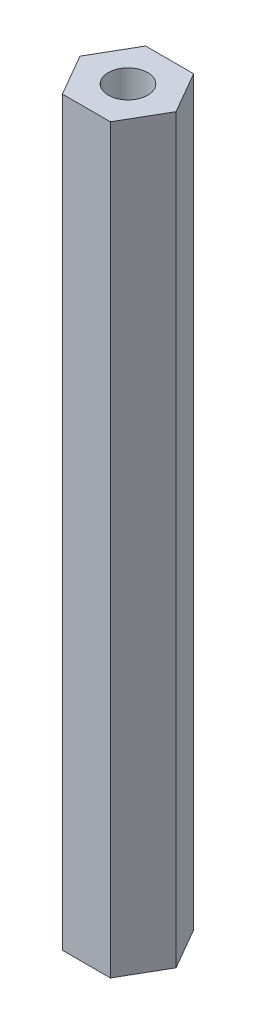
ISO-10303-21;
HEADER;
FILE_DESCRIPTION(('STEP AP214'),'2;1');
FILE_NAME('part.step','',(''),(''),'','','');
FILE_SCHEMA(('AUTOMOTIVE_DESIGN { 1 0 10303 214 1 1 1 1 }'));
ENDSEC;
DATA;
#1=APPLICATION_CONTEXT('core data for automotive mechanical design processes');
#2=APPLICATION_PROTOCOL_DEFINITION('international standard','automotive_design',2000,#1);
#3=PRODUCT_CONTEXT('',#1,'mechanical');
#4=PRODUCT('Part','Part','',(#3));
#5=PRODUCT_RELATED_PRODUCT_CATEGORY('part','',(#4));
#6=PRODUCT_DEFINITION_FORMATION('','',#4);
#7=PRODUCT_DEFINITION_CONTEXT('part definition',#1,'design');
#8=PRODUCT_DEFINITION('design','',#6,#7);
#9=PRODUCT_DEFINITION_SHAPE('','',#8);
#10=(LENGTH_UNIT() NAMED_UNIT(*) SI_UNIT(.MILLI.,.METRE.));
#11=(NAMED_UNIT(*) PLANE_ANGLE_UNIT() SI_UNIT($,.RADIAN.));
#12=(NAMED_UNIT(*) SI_UNIT($,.STERADIAN.) SOLID_ANGLE_UNIT());
#13=UNCERTAINTY_MEASURE_WITH_UNIT(LENGTH_MEASURE(1.E-05),#10,'distance_accuracy_value','');
#14=(GEOMETRIC_REPRESENTATION_CONTEXT(3) GLOBAL_UNCERTAINTY_ASSIGNED_CONTEXT((#13)) GLOBAL_UNIT_ASSIGNED_CONTEXT((#10,
#11,#12)) REPRESENTATION_CONTEXT('',''));
#15=CARTESIAN_POINT('',(0.,0.,0.));
#16=DIRECTION('',(0.,0.,1.));
#17=DIRECTION('',(1.,0.,0.));
#18=AXIS2_PLACEMENT_3D('',#15,#16,#17);
#19=CARTESIAN_POINT('',(1.5877132402715,-24.5,2.74999999999998));
#20=DIRECTION('',(0.866025403784442,0.,0.499999999999995));
#21=DIRECTION('',(0.499999999999995,0.,-0.866025403784442));
#22=AXIS2_PLACEMENT_3D('',#19,#20,#21);
#23=PLANE('',#22);
#24=DIRECTION('',(0.,1.,0.));
#25=VECTOR('',#24,1.);
#26=CARTESIAN_POINT('',(3.17542648054294,-24.5,0.));
#27=LINE('',#26,#25);
#28=CARTESIAN_POINT('',(3.17542648054294,-24.5,0.));
#29=VERTEX_POINT('',#28);
#30=CARTESIAN_POINT('',(3.17542648054294,24.5,0.));
#31=VERTEX_POINT('',#30);
#32=EDGE_CURVE('E42',#29,#31,#27,.T.);
#33=ORIENTED_EDGE('',*,*,#32,.T.);
#34=DIRECTION('',(0.499999999999995,0.,-0.866025403784442));
#35=VECTOR('',#34,1.);
#36=CARTESIAN_POINT('',(1.5877132402715,24.5,2.74999999999998));
#37=LINE('',#36,#35);
#38=CARTESIAN_POINT('',(1.5877132402715,24.5,2.74999999999998));
#39=VERTEX_POINT('',#38);
#40=EDGE_CURVE('E122',#39,#31,#37,.T.);
#41=ORIENTED_EDGE('',*,*,#40,.F.);
#42=DIRECTION('',(0.,1.,0.));
#43=VECTOR('',#42,1.);
#44=CARTESIAN_POINT('',(1.5877132402715,-24.5,2.74999999999998));
#45=LINE('',#44,#43);
#46=CARTESIAN_POINT('',(1.5877132402715,-24.5,2.74999999999998));
#47=VERTEX_POINT('',#46);
#48=EDGE_CURVE('E11',#47,#39,#45,.T.);
#49=ORIENTED_EDGE('',*,*,#48,.F.);
#50=DIRECTION('',(0.499999999999995,0.,-0.866025403784442));
#51=VECTOR('',#50,1.);
#52=CARTESIAN_POINT('',(1.5877132402715,-24.5,2.74999999999998));
#53=LINE('',#52,#51);
#54=EDGE_CURVE('E146',#47,#29,#53,.T.);
#55=ORIENTED_EDGE('',*,*,#54,.T.);
#56=EDGE_LOOP('',(#33,#41,#49,#55));
#57=FACE_BOUND('',#56,.T.);
#58=ADVANCED_FACE('F39',(#57),#23,.T.);
#59=CARTESIAN_POINT('',(-1.58771324027145,-24.5,2.75000000000002));
#60=DIRECTION('',(0.,0.,1.));
#61=DIRECTION('',(1.,0.,0.));
#62=AXIS2_PLACEMENT_3D('',#59,#60,#61);
#63=PLANE('',#62);
#64=ORIENTED_EDGE('',*,*,#48,.T.);
#65=DIRECTION('',(1.,0.,0.));
#66=VECTOR('',#65,1.);
#67=CARTESIAN_POINT('',(-1.58771324027145,24.5,2.75000000000002));
#68=LINE('',#67,#66);
#69=CARTESIAN_POINT('',(-1.58771324027145,24.5,2.75000000000002));
#70=VERTEX_POINT('',#69);
#71=EDGE_CURVE('E142',#70,#39,#68,.T.);
#72=ORIENTED_EDGE('',*,*,#71,.F.);
#73=DIRECTION('',(0.,1.,0.));
#74=VECTOR('',#73,1.);
#75=CARTESIAN_POINT('',(-1.58771324027145,-24.5,2.75000000000002));
#76=LINE('',#75,#74);
#77=CARTESIAN_POINT('',(-1.58771324027145,-24.5,2.75000000000002));
#78=VERTEX_POINT('',#77);
#79=EDGE_CURVE('E48',#78,#70,#76,.T.);
#80=ORIENTED_EDGE('',*,*,#79,.F.);
#81=DIRECTION('',(1.,0.,0.));
#82=VECTOR('',#81,1.);
#83=CARTESIAN_POINT('',(-1.58771324027145,-24.5,2.75000000000002));
#84=LINE('',#83,#82);
#85=EDGE_CURVE('E164',#78,#47,#84,.T.);
#86=ORIENTED_EDGE('',*,*,#85,.T.);
#87=EDGE_LOOP('',(#64,#72,#80,#86));
#88=FACE_BOUND('',#87,.T.);
#89=ADVANCED_FACE('F185',(#88),#63,.T.);
#90=CARTESIAN_POINT('',(-3.17542648054294,-24.5,0.));
#91=DIRECTION('',(-0.866025403784435,0.,0.500000000000007));
#92=DIRECTION('',(0.500000000000007,0.,0.866025403784435));
#93=AXIS2_PLACEMENT_3D('',#90,#91,#92);
#94=PLANE('',#93);
#95=ORIENTED_EDGE('',*,*,#79,.T.);
#96=DIRECTION('',(0.500000000000007,0.,0.866025403784435));
#97=VECTOR('',#96,1.);
#98=CARTESIAN_POINT('',(-3.17542648054294,24.5,0.));
#99=LINE('',#98,#97);
#100=CARTESIAN_POINT('',(-3.17542648054294,24.5,0.));
#101=VERTEX_POINT('',#100);
#102=EDGE_CURVE('E138',#101,#70,#99,.T.);
#103=ORIENTED_EDGE('',*,*,#102,.F.);
#104=DIRECTION('',(0.,1.,0.));
#105=VECTOR('',#104,1.);
#106=CARTESIAN_POINT('',(-3.17542648054294,-24.5,0.));
#107=LINE('',#106,#105);
#108=CARTESIAN_POINT('',(-3.17542648054294,-24.5,0.));
#109=VERTEX_POINT('',#108);
#110=EDGE_CURVE('E169',#109,#101,#107,.T.);
#111=ORIENTED_EDGE('',*,*,#110,.F.);
#112=DIRECTION('',(0.500000000000007,0.,0.866025403784435));
#113=VECTOR('',#112,1.);
#114=CARTESIAN_POINT('',(-3.17542648054294,-24.5,0.));
#115=LINE('',#114,#113);
#116=EDGE_CURVE('E161',#109,#78,#115,.T.);
#117=ORIENTED_EDGE('',*,*,#116,.T.);
#118=EDGE_LOOP('',(#95,#103,#111,#117));
#119=FACE_BOUND('',#118,.T.);
#120=ADVANCED_FACE('F198',(#119),#94,.T.);
#121=CARTESIAN_POINT('',(-1.58771324027148,-24.5,-2.74999999999999));
#122=DIRECTION('',(-0.866025403784442,0.,-0.499999999999995));
#123=DIRECTION('',(-0.499999999999995,0.,0.866025403784442));
#124=AXIS2_PLACEMENT_3D('',#121,#122,#123);
#125=PLANE('',#124);
#126=ORIENTED_EDGE('',*,*,#110,.T.);
#127=DIRECTION('',(-0.499999999999995,0.,0.866025403784441));
#128=VECTOR('',#127,1.);
#129=CARTESIAN_POINT('',(-1.58771324027148,24.5,-2.74999999999999));
#130=LINE('',#129,#128);
#131=CARTESIAN_POINT('',(-1.58771324027148,24.5,-2.74999999999999));
#132=VERTEX_POINT('',#131);
#133=EDGE_CURVE('E134',#132,#101,#130,.T.);
#134=ORIENTED_EDGE('',*,*,#133,.F.);
#135=DIRECTION('',(0.,1.,0.));
#136=VECTOR('',#135,1.);
#137=CARTESIAN_POINT('',(-1.58771324027148,-24.5,-2.74999999999999));
#138=LINE('',#137,#136);
#139=CARTESIAN_POINT('',(-1.58771324027148,-24.5,-2.74999999999999));
#140=VERTEX_POINT('',#139);
#141=EDGE_CURVE('E172',#140,#132,#138,.T.);
#142=ORIENTED_EDGE('',*,*,#141,.F.);
#143=DIRECTION('',(-0.499999999999995,0.,0.866025403784441));
#144=VECTOR('',#143,1.);
#145=CARTESIAN_POINT('',(-1.58771324027148,-24.5,-2.74999999999999));
#146=LINE('',#145,#144);
#147=EDGE_CURVE('E157',#140,#109,#146,.T.);
#148=ORIENTED_EDGE('',*,*,#147,.T.);
#149=EDGE_LOOP('',(#126,#134,#142,#148));
#150=FACE_BOUND('',#149,.T.);
#151=ADVANCED_FACE('F196',(#150),#125,.T.);
#152=CARTESIAN_POINT('',(1.58771324027147,-24.5,-2.75000000000001));
#153=DIRECTION('',(0.,0.,-1.));
#154=DIRECTION('',(-1.,0.,0.));
#155=AXIS2_PLACEMENT_3D('',#152,#153,#154);
#156=PLANE('',#155);
#157=ORIENTED_EDGE('',*,*,#141,.T.);
#158=DIRECTION('',(-1.,0.,0.));
#159=VECTOR('',#158,1.);
#160=CARTESIAN_POINT('',(1.58771324027147,24.5,-2.75000000000001));
#161=LINE('',#160,#159);
#162=CARTESIAN_POINT('',(1.58771324027147,24.5,-2.75000000000001));
#163=VERTEX_POINT('',#162);
#164=EDGE_CURVE('E130',#163,#132,#161,.T.);
#165=ORIENTED_EDGE('',*,*,#164,.F.);
#166=DIRECTION('',(0.,1.,0.));
#167=VECTOR('',#166,1.);
#168=CARTESIAN_POINT('',(1.58771324027147,-24.5,-2.75000000000001));
#169=LINE('',#168,#167);
#170=CARTESIAN_POINT('',(1.58771324027147,-24.5,-2.75000000000001));
#171=VERTEX_POINT('',#170);
#172=EDGE_CURVE('E174',#171,#163,#169,.T.);
#173=ORIENTED_EDGE('',*,*,#172,.F.);
#174=DIRECTION('',(-1.,0.,0.));
#175=VECTOR('',#174,1.);
#176=CARTESIAN_POINT('',(1.58771324027147,-24.5,-2.75000000000001));
#177=LINE('',#176,#175);
#178=EDGE_CURVE('E153',#171,#140,#177,.T.);
#179=ORIENTED_EDGE('',*,*,#178,.T.);
#180=EDGE_LOOP('',(#157,#165,#173,#179));
#181=FACE_BOUND('',#180,.T.);
#182=ADVANCED_FACE('F193',(#181),#156,.T.);
#183=CARTESIAN_POINT('',(3.17542648054294,-24.5,0.));
#184=DIRECTION('',(0.866025403784438,0.,-0.500000000000001));
#185=DIRECTION('',(-0.500000000000001,0.,-0.866025403784438));
#186=AXIS2_PLACEMENT_3D('',#183,#184,#185);
#187=PLANE('',#186);
#188=ORIENTED_EDGE('',*,*,#172,.T.);
#189=DIRECTION('',(-0.500000000000001,0.,-0.866025403784438));
#190=VECTOR('',#189,1.);
#191=CARTESIAN_POINT('',(3.17542648054294,24.5,0.));
#192=LINE('',#191,#190);
#193=EDGE_CURVE('E126',#31,#163,#192,.T.);
#194=ORIENTED_EDGE('',*,*,#193,.F.);
#195=ORIENTED_EDGE('',*,*,#32,.F.);
#196=DIRECTION('',(-0.500000000000001,0.,-0.866025403784438));
#197=VECTOR('',#196,1.);
#198=CARTESIAN_POINT('',(3.17542648054294,-24.5,0.));
#199=LINE('',#198,#197);
#200=EDGE_CURVE('E149',#29,#171,#199,.T.);
#201=ORIENTED_EDGE('',*,*,#200,.T.);
#202=EDGE_LOOP('',(#188,#194,#195,#201));
#203=FACE_BOUND('',#202,.T.);
#204=ADVANCED_FACE('F180',(#203),#187,.T.);
#205=CARTESIAN_POINT('',(0.,-24.5,0.));
#206=DIRECTION('',(0.,1.,0.));
#207=DIRECTION('',(0.,0.,1.));
#208=AXIS2_PLACEMENT_3D('',#205,#206,#207);
#209=PLANE('',#208);
#210=CARTESIAN_POINT('',(0.,-24.5,0.));
#211=DIRECTION('',(0.,-1.,0.));
#212=DIRECTION('',(0.,0.,-1.));
#213=AXIS2_PLACEMENT_3D('',#210,#211,#212);
#214=CIRCLE('',#213,1.29999999999999);
#215=CARTESIAN_POINT('',(0.,-24.5,-1.29999999999999));
#216=VERTEX_POINT('',#215);
#217=EDGE_CURVE('E109',#216,#216,#214,.T.);
#218=ORIENTED_EDGE('',*,*,#217,.F.);
#219=EDGE_LOOP('',(#218));
#220=FACE_BOUND('',#219,.T.);
#221=ORIENTED_EDGE('',*,*,#54,.F.);
#222=ORIENTED_EDGE('',*,*,#85,.F.);
#223=ORIENTED_EDGE('',*,*,#116,.F.);
#224=ORIENTED_EDGE('',*,*,#147,.F.);
#225=ORIENTED_EDGE('',*,*,#178,.F.);
#226=ORIENTED_EDGE('',*,*,#200,.F.);
#227=EDGE_LOOP('',(#221,#222,#223,#224,#225,#226));
#228=FACE_BOUND('',#227,.T.);
#229=ADVANCED_FACE('F189',(#220,#228),#209,.F.);
#230=CARTESIAN_POINT('',(0.,24.5,0.));
#231=DIRECTION('',(0.,1.,0.));
#232=DIRECTION('',(0.,0.,1.));
#233=AXIS2_PLACEMENT_3D('',#230,#231,#232);
#234=PLANE('',#233);
#235=CARTESIAN_POINT('',(0.,24.5,0.));
#236=DIRECTION('',(0.,1.,0.));
#237=DIRECTION('',(0.,0.,1.));
#238=AXIS2_PLACEMENT_3D('',#235,#236,#237);
#239=CIRCLE('',#238,1.29999999999999);
#240=CARTESIAN_POINT('',(0.,24.5,1.29999999999999));
#241=VERTEX_POINT('',#240);
#242=EDGE_CURVE('E108',#241,#241,#239,.T.);
#243=ORIENTED_EDGE('',*,*,#242,.F.);
#244=EDGE_LOOP('',(#243));
#245=FACE_BOUND('',#244,.T.);
#246=ORIENTED_EDGE('',*,*,#40,.T.);
#247=ORIENTED_EDGE('',*,*,#193,.T.);
#248=ORIENTED_EDGE('',*,*,#164,.T.);
#249=ORIENTED_EDGE('',*,*,#133,.T.);
#250=ORIENTED_EDGE('',*,*,#102,.T.);
#251=ORIENTED_EDGE('',*,*,#71,.T.);
#252=EDGE_LOOP('',(#246,#247,#248,#249,#250,#251));
#253=FACE_BOUND('',#252,.T.);
#254=ADVANCED_FACE('F183',(#245,#253),#234,.T.);
#255=CARTESIAN_POINT('',(0.,18.15,0.));
#256=DIRECTION('',(0.,1.,0.));
#257=DIRECTION('',(0.,0.,1.));
#258=AXIS2_PLACEMENT_3D('',#255,#256,#257);
#259=CONICAL_SURFACE('',#258,1.29999999999999,1.02974425867665);
#260=CARTESIAN_POINT('',(0.,17.3688811952642,0.));
#261=VERTEX_POINT('',#260);
#262=VERTEX_LOOP('',#261);
#263=FACE_BOUND('',#262,.T.);
#264=CARTESIAN_POINT('',(0.,18.15,0.));
#265=DIRECTION('',(0.,1.,0.));
#266=DIRECTION('',(0.,0.,1.));
#267=AXIS2_PLACEMENT_3D('',#264,#265,#266);
#268=CIRCLE('',#267,1.29999999999999);
#269=CARTESIAN_POINT('',(0.,18.15,1.29999999999999));
#270=VERTEX_POINT('',#269);
#271=EDGE_CURVE('E114',#270,#270,#268,.T.);
#272=ORIENTED_EDGE('',*,*,#271,.T.);
#273=EDGE_LOOP('',(#272));
#274=FACE_BOUND('',#273,.T.);
#275=ADVANCED_FACE('F250',(#263,#274),#259,.F.);
#276=CARTESIAN_POINT('',(0.,24.5,0.));
#277=DIRECTION('',(0.,1.,0.));
#278=DIRECTION('',(0.,0.,1.));
#279=AXIS2_PLACEMENT_3D('',#276,#277,#278);
#280=CYLINDRICAL_SURFACE('',#279,1.29999999999999);
#281=ORIENTED_EDGE('',*,*,#271,.F.);
#282=EDGE_LOOP('',(#281));
#283=FACE_BOUND('',#282,.T.);
#284=ORIENTED_EDGE('',*,*,#242,.T.);
#285=EDGE_LOOP('',(#284));
#286=FACE_BOUND('',#285,.T.);
#287=ADVANCED_FACE('F101',(#283,#286),#280,.F.);
#288=CARTESIAN_POINT('',(0.,-18.15,0.));
#289=DIRECTION('',(0.,-1.,0.));
#290=DIRECTION('',(0.,0.,-1.));
#291=AXIS2_PLACEMENT_3D('',#288,#289,#290);
#292=CONICAL_SURFACE('',#291,1.29999999999999,1.02974425867665);
#293=CARTESIAN_POINT('',(0.,-17.3688811952642,0.));
#294=VERTEX_POINT('',#293);
#295=VERTEX_LOOP('',#294);
#296=FACE_BOUND('',#295,.T.);
#297=CARTESIAN_POINT('',(0.,-18.15,0.));
#298=DIRECTION('',(0.,-1.,0.));
#299=DIRECTION('',(0.,0.,-1.));
#300=AXIS2_PLACEMENT_3D('',#297,#298,#299);
#301=CIRCLE('',#300,1.29999999999999);
#302=CARTESIAN_POINT('',(0.,-18.15,-1.29999999999999));
#303=VERTEX_POINT('',#302);
#304=EDGE_CURVE('E105',#303,#303,#301,.T.);
#305=ORIENTED_EDGE('',*,*,#304,.T.);
#306=EDGE_LOOP('',(#305));
#307=FACE_BOUND('',#306,.T.);
#308=ADVANCED_FACE('F97',(#296,#307),#292,.F.);
#309=CARTESIAN_POINT('',(0.,-24.5,0.));
#310=DIRECTION('',(0.,-1.,0.));
#311=DIRECTION('',(0.,0.,-1.));
#312=AXIS2_PLACEMENT_3D('',#309,#310,#311);
#313=CYLINDRICAL_SURFACE('',#312,1.29999999999999);
#314=ORIENTED_EDGE('',*,*,#304,.F.);
#315=EDGE_LOOP('',(#314));
#316=FACE_BOUND('',#315,.T.);
#317=ORIENTED_EDGE('',*,*,#217,.T.);
#318=EDGE_LOOP('',(#317));
#319=FACE_BOUND('',#318,.T.);
#320=ADVANCED_FACE('F100',(#316,#319),#313,.F.);
#321=CLOSED_SHELL('',(#58,#89,#120,#151,#182,#204,#229,#254,#275,#287,#308,#320));
#322=MANIFOLD_SOLID_BREP('B2',#321);
#323=ADVANCED_BREP_SHAPE_REPRESENTATION('',(#18,#322),#14);
#324=SHAPE_DEFINITION_REPRESENTATION(#9,#323);
ENDSEC;
END-ISO-10303-21;
